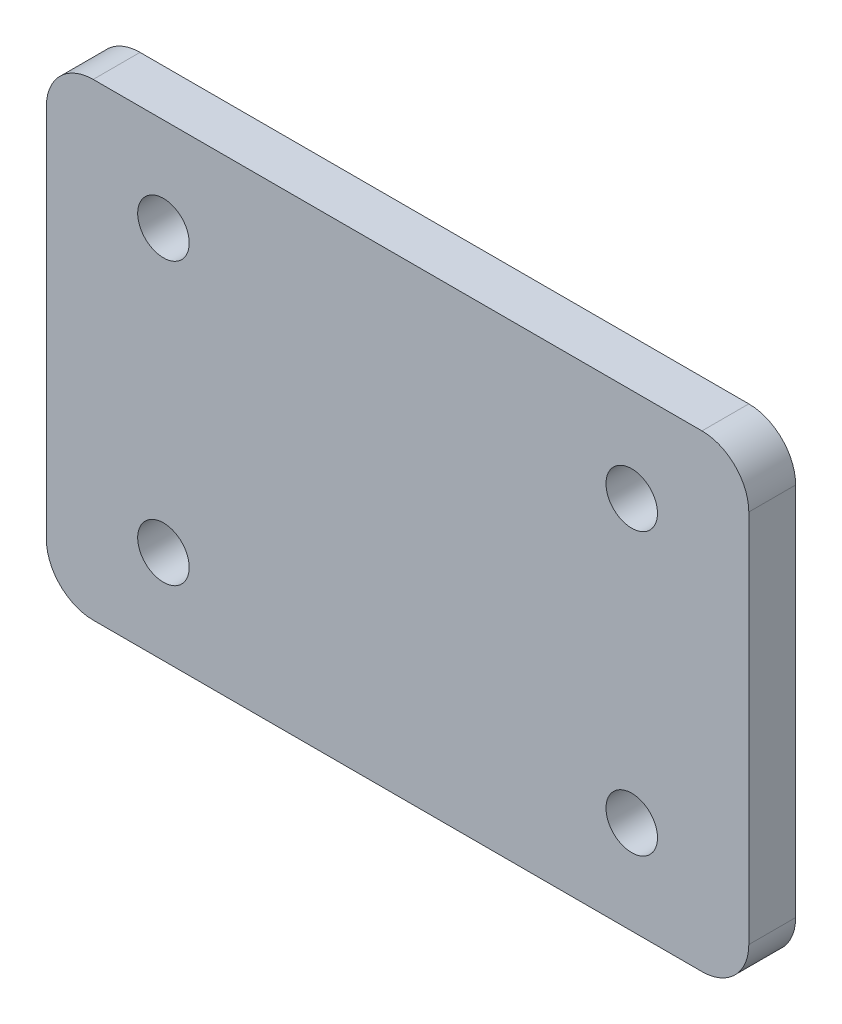
ISO-10303-21;
HEADER;
FILE_DESCRIPTION(('STEP AP214'),'2;1');
FILE_NAME('part.step','',(''),(''),'','','');
FILE_SCHEMA(('AUTOMOTIVE_DESIGN { 1 0 10303 214 1 1 1 1 }'));
ENDSEC;
DATA;
#1=APPLICATION_CONTEXT('core data for automotive mechanical design processes');
#2=APPLICATION_PROTOCOL_DEFINITION('international standard','automotive_design',2000,#1);
#3=PRODUCT_CONTEXT('',#1,'mechanical');
#4=PRODUCT('Part','Part','',(#3));
#5=PRODUCT_RELATED_PRODUCT_CATEGORY('part','',(#4));
#6=PRODUCT_DEFINITION_FORMATION('','',#4);
#7=PRODUCT_DEFINITION_CONTEXT('part definition',#1,'design');
#8=PRODUCT_DEFINITION('design','',#6,#7);
#9=PRODUCT_DEFINITION_SHAPE('','',#8);
#10=(LENGTH_UNIT() NAMED_UNIT(*) SI_UNIT(.MILLI.,.METRE.));
#11=(NAMED_UNIT(*) PLANE_ANGLE_UNIT() SI_UNIT($,.RADIAN.));
#12=(NAMED_UNIT(*) SI_UNIT($,.STERADIAN.) SOLID_ANGLE_UNIT());
#13=UNCERTAINTY_MEASURE_WITH_UNIT(LENGTH_MEASURE(1.E-05),#10,'distance_accuracy_value','');
#14=(GEOMETRIC_REPRESENTATION_CONTEXT(3) GLOBAL_UNCERTAINTY_ASSIGNED_CONTEXT((#13)) GLOBAL_UNIT_ASSIGNED_CONTEXT((#10,
#11,#12)) REPRESENTATION_CONTEXT('',''));
#15=CARTESIAN_POINT('',(0.,0.,0.));
#16=DIRECTION('',(0.,0.,1.));
#17=DIRECTION('',(1.,0.,0.));
#18=AXIS2_PLACEMENT_3D('',#15,#16,#17);
#19=CARTESIAN_POINT('',(74.9999999999999,50.,10.));
#20=DIRECTION('',(1.,0.,0.));
#21=DIRECTION('',(0.,1.,0.));
#22=AXIS2_PLACEMENT_3D('',#19,#20,#21);
#23=PLANE('',#22);
#24=DIRECTION('',(0.,1.,0.));
#25=VECTOR('',#24,1.);
#26=CARTESIAN_POINT('',(74.9999999999999,50.,10.));
#27=LINE('',#26,#25);
#28=CARTESIAN_POINT('',(75.,-39.9999999999999,10.));
#29=VERTEX_POINT('',#28);
#30=CARTESIAN_POINT('',(74.9999999999999,40.,10.));
#31=VERTEX_POINT('',#30);
#32=EDGE_CURVE('E137',#29,#31,#27,.T.);
#33=ORIENTED_EDGE('',*,*,#32,.F.);
#34=DIRECTION('',(0.,0.,-1.));
#35=VECTOR('',#34,1.);
#36=CARTESIAN_POINT('',(75.,-39.9999999999999,10.));
#37=LINE('',#36,#35);
#38=CARTESIAN_POINT('',(75.,-39.9999999999999,0.));
#39=VERTEX_POINT('',#38);
#40=EDGE_CURVE('E114',#39,#29,#37,.F.);
#41=ORIENTED_EDGE('',*,*,#40,.F.);
#42=DIRECTION('',(0.,1.,0.));
#43=VECTOR('',#42,1.);
#44=CARTESIAN_POINT('',(74.9999999999999,50.,0.));
#45=LINE('',#44,#43);
#46=CARTESIAN_POINT('',(74.9999999999999,40.,0.));
#47=VERTEX_POINT('',#46);
#48=EDGE_CURVE('E126',#39,#47,#45,.T.);
#49=ORIENTED_EDGE('',*,*,#48,.T.);
#50=DIRECTION('',(0.,0.,-1.));
#51=VECTOR('',#50,1.);
#52=CARTESIAN_POINT('',(74.9999999999999,40.,10.));
#53=LINE('',#52,#51);
#54=EDGE_CURVE('E139',#31,#47,#53,.T.);
#55=ORIENTED_EDGE('',*,*,#54,.F.);
#56=EDGE_LOOP('',(#33,#41,#49,#55));
#57=FACE_BOUND('',#56,.T.);
#58=ADVANCED_FACE('F43',(#57),#23,.T.);
#59=CARTESIAN_POINT('',(-75.,-49.9999999999998,10.));
#60=DIRECTION('',(0.,-1.,0.));
#61=DIRECTION('',(0.,0.,1.));
#62=AXIS2_PLACEMENT_3D('',#59,#60,#61);
#63=PLANE('',#62);
#64=DIRECTION('',(1.,0.,0.));
#65=VECTOR('',#64,1.);
#66=CARTESIAN_POINT('',(-75.,-49.9999999999998,10.));
#67=LINE('',#66,#65);
#68=CARTESIAN_POINT('',(-65.,-49.9999999999999,10.));
#69=VERTEX_POINT('',#68);
#70=CARTESIAN_POINT('',(65.,-49.9999999999999,10.));
#71=VERTEX_POINT('',#70);
#72=EDGE_CURVE('E140',#69,#71,#67,.T.);
#73=ORIENTED_EDGE('',*,*,#72,.F.);
#74=DIRECTION('',(0.,0.,-1.));
#75=VECTOR('',#74,1.);
#76=CARTESIAN_POINT('',(-65.,-49.9999999999999,10.));
#77=LINE('',#76,#75);
#78=CARTESIAN_POINT('',(-65.,-49.9999999999998,0.));
#79=VERTEX_POINT('',#78);
#80=EDGE_CURVE('E178',#79,#69,#77,.F.);
#81=ORIENTED_EDGE('',*,*,#80,.F.);
#82=DIRECTION('',(1.,0.,0.));
#83=VECTOR('',#82,1.);
#84=CARTESIAN_POINT('',(-75.,-49.9999999999998,0.));
#85=LINE('',#84,#83);
#86=CARTESIAN_POINT('',(65.,-49.9999999999999,0.));
#87=VERTEX_POINT('',#86);
#88=EDGE_CURVE('E151',#79,#87,#85,.T.);
#89=ORIENTED_EDGE('',*,*,#88,.T.);
#90=DIRECTION('',(0.,0.,-1.));
#91=VECTOR('',#90,1.);
#92=CARTESIAN_POINT('',(65.,-49.9999999999999,10.));
#93=LINE('',#92,#91);
#94=EDGE_CURVE('E117',#71,#87,#93,.T.);
#95=ORIENTED_EDGE('',*,*,#94,.F.);
#96=EDGE_LOOP('',(#73,#81,#89,#95));
#97=FACE_BOUND('',#96,.T.);
#98=ADVANCED_FACE('F274',(#97),#63,.T.);
#99=CARTESIAN_POINT('',(-75.0000000000001,50.,10.));
#100=DIRECTION('',(-1.,0.,0.));
#101=DIRECTION('',(0.,-1.,0.));
#102=AXIS2_PLACEMENT_3D('',#99,#100,#101);
#103=PLANE('',#102);
#104=DIRECTION('',(0.,-1.,0.));
#105=VECTOR('',#104,1.);
#106=CARTESIAN_POINT('',(-75.0000000000001,50.,10.));
#107=LINE('',#106,#105);
#108=CARTESIAN_POINT('',(-75.0000000000001,40.,10.));
#109=VERTEX_POINT('',#108);
#110=CARTESIAN_POINT('',(-75.,-39.9999999999998,10.));
#111=VERTEX_POINT('',#110);
#112=EDGE_CURVE('E148',#109,#111,#107,.T.);
#113=ORIENTED_EDGE('',*,*,#112,.F.);
#114=DIRECTION('',(0.,0.,-1.));
#115=VECTOR('',#114,1.);
#116=CARTESIAN_POINT('',(-75.0000000000001,40.,10.));
#117=LINE('',#116,#115);
#118=CARTESIAN_POINT('',(-75.0000000000001,40.,0.));
#119=VERTEX_POINT('',#118);
#120=EDGE_CURVE('E52',#119,#109,#117,.F.);
#121=ORIENTED_EDGE('',*,*,#120,.F.);
#122=DIRECTION('',(0.,-1.,0.));
#123=VECTOR('',#122,1.);
#124=CARTESIAN_POINT('',(-75.0000000000001,50.,0.));
#125=LINE('',#124,#123);
#126=CARTESIAN_POINT('',(-75.,-39.9999999999998,0.));
#127=VERTEX_POINT('',#126);
#128=EDGE_CURVE('E202',#119,#127,#125,.T.);
#129=ORIENTED_EDGE('',*,*,#128,.T.);
#130=DIRECTION('',(0.,0.,-1.));
#131=VECTOR('',#130,1.);
#132=CARTESIAN_POINT('',(-75.,-39.9999999999998,10.));
#133=LINE('',#132,#131);
#134=EDGE_CURVE('E11',#111,#127,#133,.T.);
#135=ORIENTED_EDGE('',*,*,#134,.F.);
#136=EDGE_LOOP('',(#113,#121,#129,#135));
#137=FACE_BOUND('',#136,.T.);
#138=ADVANCED_FACE('F191',(#137),#103,.T.);
#139=CARTESIAN_POINT('',(-75.0000000000001,50.,10.));
#140=DIRECTION('',(0.,1.,0.));
#141=DIRECTION('',(0.,0.,-1.));
#142=AXIS2_PLACEMENT_3D('',#139,#140,#141);
#143=PLANE('',#142);
#144=DIRECTION('',(-1.,0.,0.));
#145=VECTOR('',#144,1.);
#146=CARTESIAN_POINT('',(-75.0000000000001,50.,0.));
#147=LINE('',#146,#145);
#148=CARTESIAN_POINT('',(64.9999999999999,50.,0.));
#149=VERTEX_POINT('',#148);
#150=CARTESIAN_POINT('',(-65.0000000000001,50.,0.));
#151=VERTEX_POINT('',#150);
#152=EDGE_CURVE('E133',#149,#151,#147,.T.);
#153=ORIENTED_EDGE('',*,*,#152,.T.);
#154=DIRECTION('',(0.,0.,-1.));
#155=VECTOR('',#154,1.);
#156=CARTESIAN_POINT('',(-65.0000000000001,50.,10.));
#157=LINE('',#156,#155);
#158=CARTESIAN_POINT('',(-65.0000000000001,50.,10.));
#159=VERTEX_POINT('',#158);
#160=EDGE_CURVE('E160',#159,#151,#157,.T.);
#161=ORIENTED_EDGE('',*,*,#160,.F.);
#162=DIRECTION('',(-1.,0.,0.));
#163=VECTOR('',#162,1.);
#164=CARTESIAN_POINT('',(-75.0000000000001,50.,10.));
#165=LINE('',#164,#163);
#166=CARTESIAN_POINT('',(64.9999999999999,50.,10.));
#167=VERTEX_POINT('',#166);
#168=EDGE_CURVE('E193',#167,#159,#165,.T.);
#169=ORIENTED_EDGE('',*,*,#168,.F.);
#170=DIRECTION('',(0.,0.,-1.));
#171=VECTOR('',#170,1.);
#172=CARTESIAN_POINT('',(64.9999999999999,50.,10.));
#173=LINE('',#172,#171);
#174=EDGE_CURVE('E164',#149,#167,#173,.F.);
#175=ORIENTED_EDGE('',*,*,#174,.F.);
#176=EDGE_LOOP('',(#153,#161,#169,#175));
#177=FACE_BOUND('',#176,.T.);
#178=ADVANCED_FACE('F257',(#177),#143,.T.);
#179=CARTESIAN_POINT('',(0.,0.,10.));
#180=DIRECTION('',(0.,0.,-1.));
#181=DIRECTION('',(1.,0.,0.));
#182=AXIS2_PLACEMENT_3D('',#179,#180,#181);
#183=PLANE('',#182);
#184=CARTESIAN_POINT('',(50.,30.,10.));
#185=DIRECTION('',(0.,0.,1.));
#186=DIRECTION('',(1.,0.,0.));
#187=AXIS2_PLACEMENT_3D('',#184,#185,#186);
#188=CIRCLE('',#187,5.5);
#189=CARTESIAN_POINT('',(55.5,30.,10.));
#190=VERTEX_POINT('',#189);
#191=EDGE_CURVE('E134',#190,#190,#188,.T.);
#192=ORIENTED_EDGE('',*,*,#191,.F.);
#193=EDGE_LOOP('',(#192));
#194=FACE_BOUND('',#193,.T.);
#195=CARTESIAN_POINT('',(50.,-30.,10.));
#196=DIRECTION('',(0.,0.,1.));
#197=DIRECTION('',(1.,0.,0.));
#198=AXIS2_PLACEMENT_3D('',#195,#196,#197);
#199=CIRCLE('',#198,5.5);
#200=CARTESIAN_POINT('',(55.5,-30.,10.));
#201=VERTEX_POINT('',#200);
#202=EDGE_CURVE('E214',#201,#201,#199,.T.);
#203=ORIENTED_EDGE('',*,*,#202,.F.);
#204=EDGE_LOOP('',(#203));
#205=FACE_BOUND('',#204,.T.);
#206=CARTESIAN_POINT('',(-50.,-30.,10.));
#207=DIRECTION('',(0.,0.,1.));
#208=DIRECTION('',(1.,0.,0.));
#209=AXIS2_PLACEMENT_3D('',#206,#207,#208);
#210=CIRCLE('',#209,5.5);
#211=CARTESIAN_POINT('',(-44.5,-30.,10.));
#212=VERTEX_POINT('',#211);
#213=EDGE_CURVE('E218',#212,#212,#210,.T.);
#214=ORIENTED_EDGE('',*,*,#213,.F.);
#215=EDGE_LOOP('',(#214));
#216=FACE_BOUND('',#215,.T.);
#217=CARTESIAN_POINT('',(-50.,30.,10.));
#218=DIRECTION('',(0.,0.,1.));
#219=DIRECTION('',(1.,0.,0.));
#220=AXIS2_PLACEMENT_3D('',#217,#218,#219);
#221=CIRCLE('',#220,5.5);
#222=CARTESIAN_POINT('',(-44.5,30.,10.));
#223=VERTEX_POINT('',#222);
#224=EDGE_CURVE('E222',#223,#223,#221,.T.);
#225=ORIENTED_EDGE('',*,*,#224,.F.);
#226=EDGE_LOOP('',(#225));
#227=FACE_BOUND('',#226,.T.);
#228=ORIENTED_EDGE('',*,*,#168,.T.);
#229=CARTESIAN_POINT('',(-65.0000000000001,40.,10.));
#230=DIRECTION('',(0.,0.,1.));
#231=DIRECTION('',(1.,0.,0.));
#232=AXIS2_PLACEMENT_3D('',#229,#230,#231);
#233=CIRCLE('',#232,10.);
#234=EDGE_CURVE('E66',#109,#159,#233,.F.);
#235=ORIENTED_EDGE('',*,*,#234,.F.);
#236=ORIENTED_EDGE('',*,*,#112,.T.);
#237=CARTESIAN_POINT('',(-65.,-39.9999999999999,10.));
#238=DIRECTION('',(0.,0.,1.));
#239=DIRECTION('',(1.,0.,0.));
#240=AXIS2_PLACEMENT_3D('',#237,#238,#239);
#241=CIRCLE('',#240,10.);
#242=EDGE_CURVE('E58',#69,#111,#241,.F.);
#243=ORIENTED_EDGE('',*,*,#242,.F.);
#244=ORIENTED_EDGE('',*,*,#72,.T.);
#245=CARTESIAN_POINT('',(65.,-39.9999999999999,10.));
#246=DIRECTION('',(0.,0.,1.));
#247=DIRECTION('',(1.,0.,0.));
#248=AXIS2_PLACEMENT_3D('',#245,#246,#247);
#249=CIRCLE('',#248,10.);
#250=EDGE_CURVE('E172',#29,#71,#249,.F.);
#251=ORIENTED_EDGE('',*,*,#250,.F.);
#252=ORIENTED_EDGE('',*,*,#32,.T.);
#253=CARTESIAN_POINT('',(64.9999999999999,40.,10.));
#254=DIRECTION('',(0.,0.,1.));
#255=DIRECTION('',(1.,0.,0.));
#256=AXIS2_PLACEMENT_3D('',#253,#254,#255);
#257=CIRCLE('',#256,10.);
#258=EDGE_CURVE('E175',#167,#31,#257,.F.);
#259=ORIENTED_EDGE('',*,*,#258,.F.);
#260=EDGE_LOOP('',(#228,#235,#236,#243,#244,#251,#252,#259));
#261=FACE_BOUND('',#260,.T.);
#262=ADVANCED_FACE('F254',(#194,#205,#216,#227,#261),#183,.F.);
#263=CARTESIAN_POINT('',(0.,0.,0.));
#264=DIRECTION('',(0.,0.,-1.));
#265=DIRECTION('',(1.,0.,0.));
#266=AXIS2_PLACEMENT_3D('',#263,#264,#265);
#267=PLANE('',#266);
#268=CARTESIAN_POINT('',(50.,30.,0.));
#269=DIRECTION('',(0.,0.,1.));
#270=DIRECTION('',(1.,0.,0.));
#271=AXIS2_PLACEMENT_3D('',#268,#269,#270);
#272=CIRCLE('',#271,5.5);
#273=CARTESIAN_POINT('',(55.5,30.,0.));
#274=VERTEX_POINT('',#273);
#275=EDGE_CURVE('E231',#274,#274,#272,.T.);
#276=ORIENTED_EDGE('',*,*,#275,.T.);
#277=EDGE_LOOP('',(#276));
#278=FACE_BOUND('',#277,.T.);
#279=CARTESIAN_POINT('',(50.,-30.,0.));
#280=DIRECTION('',(0.,0.,1.));
#281=DIRECTION('',(1.,0.,0.));
#282=AXIS2_PLACEMENT_3D('',#279,#280,#281);
#283=CIRCLE('',#282,5.5);
#284=CARTESIAN_POINT('',(55.5,-30.,0.));
#285=VERTEX_POINT('',#284);
#286=EDGE_CURVE('E235',#285,#285,#283,.T.);
#287=ORIENTED_EDGE('',*,*,#286,.T.);
#288=EDGE_LOOP('',(#287));
#289=FACE_BOUND('',#288,.T.);
#290=CARTESIAN_POINT('',(-50.,-30.,0.));
#291=DIRECTION('',(0.,0.,1.));
#292=DIRECTION('',(1.,0.,0.));
#293=AXIS2_PLACEMENT_3D('',#290,#291,#292);
#294=CIRCLE('',#293,5.5);
#295=CARTESIAN_POINT('',(-44.5,-30.,0.));
#296=VERTEX_POINT('',#295);
#297=EDGE_CURVE('E230',#296,#296,#294,.T.);
#298=ORIENTED_EDGE('',*,*,#297,.T.);
#299=EDGE_LOOP('',(#298));
#300=FACE_BOUND('',#299,.T.);
#301=CARTESIAN_POINT('',(-50.,30.,0.));
#302=DIRECTION('',(0.,0.,1.));
#303=DIRECTION('',(1.,0.,0.));
#304=AXIS2_PLACEMENT_3D('',#301,#302,#303);
#305=CIRCLE('',#304,5.5);
#306=CARTESIAN_POINT('',(-44.5,30.,0.));
#307=VERTEX_POINT('',#306);
#308=EDGE_CURVE('E226',#307,#307,#305,.T.);
#309=ORIENTED_EDGE('',*,*,#308,.T.);
#310=EDGE_LOOP('',(#309));
#311=FACE_BOUND('',#310,.T.);
#312=ORIENTED_EDGE('',*,*,#48,.F.);
#313=CARTESIAN_POINT('',(65.,-39.9999999999999,0.));
#314=DIRECTION('',(0.,0.,1.));
#315=DIRECTION('',(1.,0.,0.));
#316=AXIS2_PLACEMENT_3D('',#313,#314,#315);
#317=CIRCLE('',#316,10.);
#318=EDGE_CURVE('E110',#87,#39,#317,.T.);
#319=ORIENTED_EDGE('',*,*,#318,.F.);
#320=ORIENTED_EDGE('',*,*,#88,.F.);
#321=CARTESIAN_POINT('',(-65.,-39.9999999999998,0.));
#322=DIRECTION('',(0.,0.,1.));
#323=DIRECTION('',(1.,0.,0.));
#324=AXIS2_PLACEMENT_3D('',#321,#322,#323);
#325=CIRCLE('',#324,10.);
#326=EDGE_CURVE('E123',#127,#79,#325,.T.);
#327=ORIENTED_EDGE('',*,*,#326,.F.);
#328=ORIENTED_EDGE('',*,*,#128,.F.);
#329=CARTESIAN_POINT('',(-65.0000000000001,40.,0.));
#330=DIRECTION('',(0.,0.,1.));
#331=DIRECTION('',(1.,0.,0.));
#332=AXIS2_PLACEMENT_3D('',#329,#330,#331);
#333=CIRCLE('',#332,10.);
#334=EDGE_CURVE('E144',#151,#119,#333,.T.);
#335=ORIENTED_EDGE('',*,*,#334,.F.);
#336=ORIENTED_EDGE('',*,*,#152,.F.);
#337=CARTESIAN_POINT('',(64.9999999999999,40.,0.));
#338=DIRECTION('',(0.,0.,1.));
#339=DIRECTION('',(1.,0.,0.));
#340=AXIS2_PLACEMENT_3D('',#337,#338,#339);
#341=CIRCLE('',#340,10.);
#342=EDGE_CURVE('E122',#47,#149,#341,.T.);
#343=ORIENTED_EDGE('',*,*,#342,.F.);
#344=EDGE_LOOP('',(#312,#319,#320,#327,#328,#335,#336,#343));
#345=FACE_BOUND('',#344,.T.);
#346=ADVANCED_FACE('F127',(#278,#289,#300,#311,#345),#267,.T.);
#347=CARTESIAN_POINT('',(-49.9999999999999,30.,18.));
#348=DIRECTION('',(0.,0.,-1.));
#349=DIRECTION('',(1.,0.,0.));
#350=AXIS2_PLACEMENT_3D('',#347,#348,#349);
#351=CYLINDRICAL_SURFACE('',#350,5.5);
#352=ORIENTED_EDGE('',*,*,#308,.F.);
#353=EDGE_LOOP('',(#352));
#354=FACE_BOUND('',#353,.T.);
#355=ORIENTED_EDGE('',*,*,#224,.T.);
#356=EDGE_LOOP('',(#355));
#357=FACE_BOUND('',#356,.T.);
#358=ADVANCED_FACE('F250',(#354,#357),#351,.F.);
#359=CARTESIAN_POINT('',(-49.9999999999999,-30.,18.));
#360=DIRECTION('',(0.,0.,-1.));
#361=DIRECTION('',(1.,0.,0.));
#362=AXIS2_PLACEMENT_3D('',#359,#360,#361);
#363=CYLINDRICAL_SURFACE('',#362,5.5);
#364=ORIENTED_EDGE('',*,*,#297,.F.);
#365=EDGE_LOOP('',(#364));
#366=FACE_BOUND('',#365,.T.);
#367=ORIENTED_EDGE('',*,*,#213,.T.);
#368=EDGE_LOOP('',(#367));
#369=FACE_BOUND('',#368,.T.);
#370=ADVANCED_FACE('F246',(#366,#369),#363,.F.);
#371=CARTESIAN_POINT('',(50.0000000000001,-30.,18.));
#372=DIRECTION('',(0.,0.,-1.));
#373=DIRECTION('',(1.,0.,0.));
#374=AXIS2_PLACEMENT_3D('',#371,#372,#373);
#375=CYLINDRICAL_SURFACE('',#374,5.5);
#376=ORIENTED_EDGE('',*,*,#286,.F.);
#377=EDGE_LOOP('',(#376));
#378=FACE_BOUND('',#377,.T.);
#379=ORIENTED_EDGE('',*,*,#202,.T.);
#380=EDGE_LOOP('',(#379));
#381=FACE_BOUND('',#380,.T.);
#382=ADVANCED_FACE('F249',(#378,#381),#375,.F.);
#383=CARTESIAN_POINT('',(50.0000000000001,30.,18.));
#384=DIRECTION('',(0.,0.,-1.));
#385=DIRECTION('',(1.,0.,0.));
#386=AXIS2_PLACEMENT_3D('',#383,#384,#385);
#387=CYLINDRICAL_SURFACE('',#386,5.5);
#388=ORIENTED_EDGE('',*,*,#275,.F.);
#389=EDGE_LOOP('',(#388));
#390=FACE_BOUND('',#389,.T.);
#391=ORIENTED_EDGE('',*,*,#191,.T.);
#392=EDGE_LOOP('',(#391));
#393=FACE_BOUND('',#392,.T.);
#394=ADVANCED_FACE('F284',(#390,#393),#387,.F.);
#395=CARTESIAN_POINT('',(64.9999999999999,40.,10.));
#396=DIRECTION('',(0.,0.,-1.));
#397=DIRECTION('',(1.,0.,0.));
#398=AXIS2_PLACEMENT_3D('',#395,#396,#397);
#399=CYLINDRICAL_SURFACE('',#398,10.);
#400=ORIENTED_EDGE('',*,*,#258,.T.);
#401=ORIENTED_EDGE('',*,*,#54,.T.);
#402=ORIENTED_EDGE('',*,*,#342,.T.);
#403=ORIENTED_EDGE('',*,*,#174,.T.);
#404=EDGE_LOOP('',(#400,#401,#402,#403));
#405=FACE_BOUND('',#404,.T.);
#406=ADVANCED_FACE('F271',(#405),#399,.T.);
#407=CARTESIAN_POINT('',(65.,-39.9999999999999,10.));
#408=DIRECTION('',(0.,0.,-1.));
#409=DIRECTION('',(1.,0.,0.));
#410=AXIS2_PLACEMENT_3D('',#407,#408,#409);
#411=CYLINDRICAL_SURFACE('',#410,10.);
#412=ORIENTED_EDGE('',*,*,#250,.T.);
#413=ORIENTED_EDGE('',*,*,#94,.T.);
#414=ORIENTED_EDGE('',*,*,#318,.T.);
#415=ORIENTED_EDGE('',*,*,#40,.T.);
#416=EDGE_LOOP('',(#412,#413,#414,#415));
#417=FACE_BOUND('',#416,.T.);
#418=ADVANCED_FACE('F112',(#417),#411,.T.);
#419=CARTESIAN_POINT('',(-65.,-39.9999999999999,10.));
#420=DIRECTION('',(0.,0.,-1.));
#421=DIRECTION('',(1.,0.,0.));
#422=AXIS2_PLACEMENT_3D('',#419,#420,#421);
#423=CYLINDRICAL_SURFACE('',#422,10.);
#424=ORIENTED_EDGE('',*,*,#242,.T.);
#425=ORIENTED_EDGE('',*,*,#134,.T.);
#426=ORIENTED_EDGE('',*,*,#326,.T.);
#427=ORIENTED_EDGE('',*,*,#80,.T.);
#428=EDGE_LOOP('',(#424,#425,#426,#427));
#429=FACE_BOUND('',#428,.T.);
#430=ADVANCED_FACE('F265',(#429),#423,.T.);
#431=CARTESIAN_POINT('',(-65.0000000000001,40.,10.));
#432=DIRECTION('',(0.,0.,-1.));
#433=DIRECTION('',(1.,0.,0.));
#434=AXIS2_PLACEMENT_3D('',#431,#432,#433);
#435=CYLINDRICAL_SURFACE('',#434,10.);
#436=ORIENTED_EDGE('',*,*,#234,.T.);
#437=ORIENTED_EDGE('',*,*,#160,.T.);
#438=ORIENTED_EDGE('',*,*,#334,.T.);
#439=ORIENTED_EDGE('',*,*,#120,.T.);
#440=EDGE_LOOP('',(#436,#437,#438,#439));
#441=FACE_BOUND('',#440,.T.);
#442=ADVANCED_FACE('F45',(#441),#435,.T.);
#443=CLOSED_SHELL('',(#58,#98,#138,#178,#262,#346,#358,#370,#382,#394,#406,#418,#430,#442));
#444=MANIFOLD_SOLID_BREP('B2',#443);
#445=ADVANCED_BREP_SHAPE_REPRESENTATION('',(#18,#444),#14);
#446=SHAPE_DEFINITION_REPRESENTATION(#9,#445);
ENDSEC;
END-ISO-10303-21;
